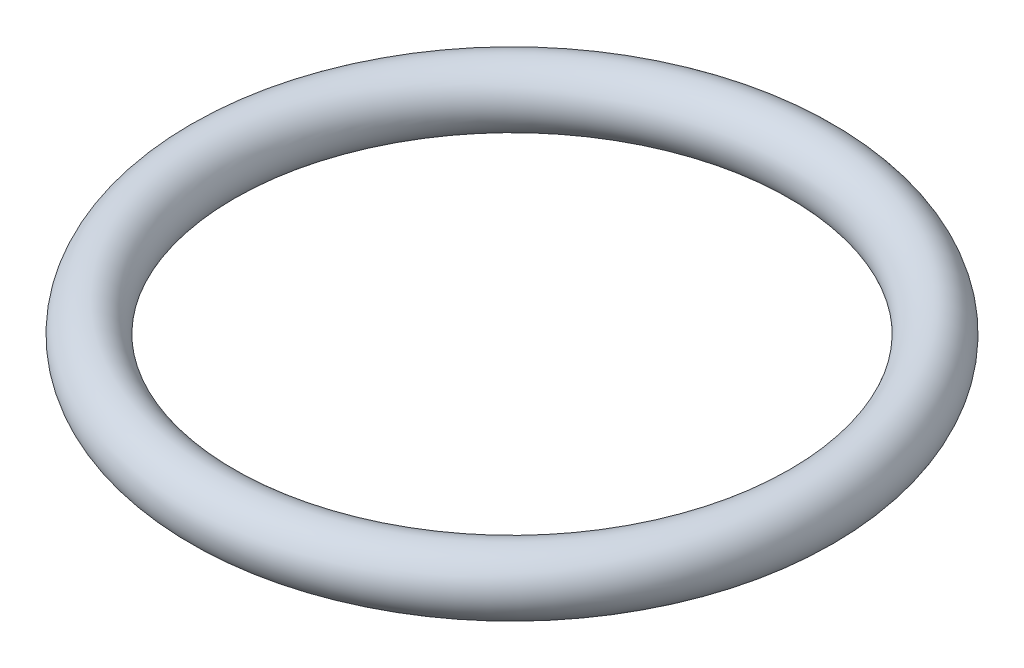
ISO-10303-21;
HEADER;
FILE_DESCRIPTION(('STEP AP214'),'2;1');
FILE_NAME('part.step','',(''),(''),'','','');
FILE_SCHEMA(('AUTOMOTIVE_DESIGN { 1 0 10303 214 1 1 1 1 }'));
ENDSEC;
DATA;
#1=APPLICATION_CONTEXT('core data for automotive mechanical design processes');
#2=APPLICATION_PROTOCOL_DEFINITION('international standard','automotive_design',2000,#1);
#3=PRODUCT_CONTEXT('',#1,'mechanical');
#4=PRODUCT('Part','Part','',(#3));
#5=PRODUCT_RELATED_PRODUCT_CATEGORY('part','',(#4));
#6=PRODUCT_DEFINITION_FORMATION('','',#4);
#7=PRODUCT_DEFINITION_CONTEXT('part definition',#1,'design');
#8=PRODUCT_DEFINITION('design','',#6,#7);
#9=PRODUCT_DEFINITION_SHAPE('','',#8);
#10=(LENGTH_UNIT() NAMED_UNIT(*) SI_UNIT(.MILLI.,.METRE.));
#11=(NAMED_UNIT(*) PLANE_ANGLE_UNIT() SI_UNIT($,.RADIAN.));
#12=(NAMED_UNIT(*) SI_UNIT($,.STERADIAN.) SOLID_ANGLE_UNIT());
#13=UNCERTAINTY_MEASURE_WITH_UNIT(LENGTH_MEASURE(1.E-05),#10,'distance_accuracy_value','');
#14=(GEOMETRIC_REPRESENTATION_CONTEXT(3) GLOBAL_UNCERTAINTY_ASSIGNED_CONTEXT((#13)) GLOBAL_UNIT_ASSIGNED_CONTEXT((#10,
#11,#12)) REPRESENTATION_CONTEXT('',''));
#15=CARTESIAN_POINT('',(0.,0.,0.));
#16=DIRECTION('',(0.,0.,1.));
#17=DIRECTION('',(1.,0.,0.));
#18=AXIS2_PLACEMENT_3D('',#15,#16,#17);
#19=CARTESIAN_POINT('',(0.,0.,0.));
#20=DIRECTION('',(0.,1.,0.));
#21=DIRECTION('',(0.,0.,1.));
#22=AXIS2_PLACEMENT_3D('',#19,#20,#21);
#23=TOROIDAL_SURFACE('',#22,13.2956376723005,1.35);
#24=CARTESIAN_POINT('',(-13.2956376723005,0.,0.));
#25=DIRECTION('',(0.,0.,1.));
#26=DIRECTION('',(1.,0.,0.));
#27=AXIS2_PLACEMENT_3D('',#24,#25,#26);
#28=CIRCLE('',#27,1.35);
#29=CARTESIAN_POINT('',(-14.6456376723005,0.,0.));
#30=VERTEX_POINT('',#29);
#31=EDGE_CURVE('E10',#30,#30,#28,.T.);
#32=CARTESIAN_POINT('',(0.,0.,0.));
#33=DIRECTION('',(0.,1.,0.));
#34=DIRECTION('',(0.,0.,1.));
#35=AXIS2_PLACEMENT_3D('',#32,#33,#34);
#36=CIRCLE('',#35,14.6456376723005);
#37=EDGE_CURVE('',#30,#30,#36,.T.);
#38=ORIENTED_EDGE('',*,*,#31,.T.);
#39=ORIENTED_EDGE('',*,*,#31,.F.);
#40=ORIENTED_EDGE('',*,*,#37,.T.);
#41=ORIENTED_EDGE('',*,*,#37,.F.);
#42=EDGE_LOOP('',(#38,#40,#39,#41));
#43=FACE_BOUND('',#42,.T.);
#44=ADVANCED_FACE('F35',(#43),#23,.T.);
#45=CLOSED_SHELL('',(#44));
#46=MANIFOLD_SOLID_BREP('B2',#45);
#47=ADVANCED_BREP_SHAPE_REPRESENTATION('',(#18,#46),#14);
#48=SHAPE_DEFINITION_REPRESENTATION(#9,#47);
ENDSEC;
END-ISO-10303-21;
